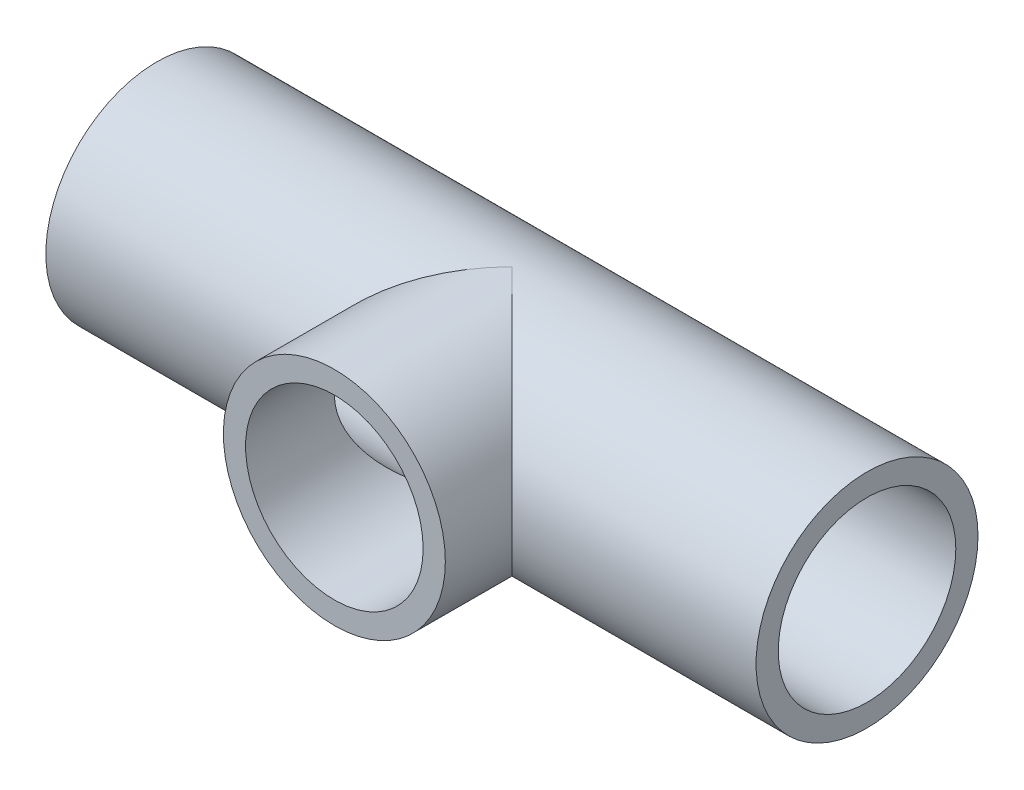
ISO-10303-21;
HEADER;
FILE_DESCRIPTION(('STEP AP214'),'2;1');
FILE_NAME('part.step','',(''),(''),'','','');
FILE_SCHEMA(('AUTOMOTIVE_DESIGN { 1 0 10303 214 1 1 1 1 }'));
ENDSEC;
DATA;
#1=APPLICATION_CONTEXT('core data for automotive mechanical design processes');
#2=APPLICATION_PROTOCOL_DEFINITION('international standard','automotive_design',2000,#1);
#3=PRODUCT_CONTEXT('',#1,'mechanical');
#4=PRODUCT('Part','Part','',(#3));
#5=PRODUCT_RELATED_PRODUCT_CATEGORY('part','',(#4));
#6=PRODUCT_DEFINITION_FORMATION('','',#4);
#7=PRODUCT_DEFINITION_CONTEXT('part definition',#1,'design');
#8=PRODUCT_DEFINITION('design','',#6,#7);
#9=PRODUCT_DEFINITION_SHAPE('','',#8);
#10=(LENGTH_UNIT() NAMED_UNIT(*) SI_UNIT(.MILLI.,.METRE.));
#11=(NAMED_UNIT(*) PLANE_ANGLE_UNIT() SI_UNIT($,.RADIAN.));
#12=(NAMED_UNIT(*) SI_UNIT($,.STERADIAN.) SOLID_ANGLE_UNIT());
#13=UNCERTAINTY_MEASURE_WITH_UNIT(LENGTH_MEASURE(1.E-05),#10,'distance_accuracy_value','');
#14=(GEOMETRIC_REPRESENTATION_CONTEXT(3) GLOBAL_UNCERTAINTY_ASSIGNED_CONTEXT((#13)) GLOBAL_UNIT_ASSIGNED_CONTEXT((#10,
#11,#12)) REPRESENTATION_CONTEXT('',''));
#15=CARTESIAN_POINT('',(0.,0.,0.));
#16=DIRECTION('',(0.,0.,1.));
#17=DIRECTION('',(1.,0.,0.));
#18=AXIS2_PLACEMENT_3D('',#15,#16,#17);
#19=CARTESIAN_POINT('',(0.,0.,12.7));
#20=DIRECTION('',(0.,0.,-1.));
#21=DIRECTION('',(-1.,0.,0.));
#22=AXIS2_PLACEMENT_3D('',#19,#20,#21);
#23=CYLINDRICAL_SURFACE('',#22,7.9375);
#24=CARTESIAN_POINT('',(0.,0.,12.7));
#25=DIRECTION('',(0.,0.,1.));
#26=DIRECTION('',(1.,0.,0.));
#27=AXIS2_PLACEMENT_3D('',#24,#25,#26);
#28=CIRCLE('',#27,7.9375);
#29=CARTESIAN_POINT('',(7.9375,0.,12.7));
#30=VERTEX_POINT('',#29);
#31=EDGE_CURVE('E11',#30,#30,#28,.T.);
#32=ORIENTED_EDGE('',*,*,#31,.F.);
#33=EDGE_LOOP('',(#32));
#34=FACE_BOUND('',#33,.T.);
#35=CARTESIAN_POINT('',(0.,0.,0.));
#36=DIRECTION('',(-0.707106781186547,0.,-0.707106781186547));
#37=DIRECTION('',(0.707106781186547,0.,-0.707106781186547));
#38=AXIS2_PLACEMENT_3D('',#35,#36,#37);
#39=ELLIPSE('',#38,11.2253201513364,7.9375);
#40=CARTESIAN_POINT('',(0.,-7.9375,0.));
#41=VERTEX_POINT('',#40);
#42=CARTESIAN_POINT('',(0.,7.9375,0.));
#43=VERTEX_POINT('',#42);
#44=EDGE_CURVE('E79',#41,#43,#39,.T.);
#45=ORIENTED_EDGE('',*,*,#44,.F.);
#46=CARTESIAN_POINT('',(0.,0.,0.));
#47=DIRECTION('',(0.707106781186547,0.,-0.707106781186547));
#48=DIRECTION('',(-0.707106781186547,0.,-0.707106781186547));
#49=AXIS2_PLACEMENT_3D('',#46,#47,#48);
#50=ELLIPSE('',#49,11.2253201513364,7.9375);
#51=EDGE_CURVE('E58',#43,#41,#50,.T.);
#52=ORIENTED_EDGE('',*,*,#51,.F.);
#53=EDGE_LOOP('',(#45,#52));
#54=FACE_BOUND('',#53,.T.);
#55=ADVANCED_FACE('F38',(#34,#54),#23,.T.);
#56=CARTESIAN_POINT('',(0.,0.,0.));
#57=DIRECTION('',(0.,0.,1.));
#58=DIRECTION('',(1.,0.,0.));
#59=AXIS2_PLACEMENT_3D('',#56,#57,#58);
#60=CYLINDRICAL_SURFACE('',#59,6.35);
#61=CARTESIAN_POINT('',(0.,0.,12.7));
#62=DIRECTION('',(0.,0.,1.));
#63=DIRECTION('',(1.,0.,0.));
#64=AXIS2_PLACEMENT_3D('',#61,#62,#63);
#65=CIRCLE('',#64,6.35);
#66=CARTESIAN_POINT('',(6.35,0.,12.7));
#67=VERTEX_POINT('',#66);
#68=EDGE_CURVE('E45',#67,#67,#65,.T.);
#69=ORIENTED_EDGE('',*,*,#68,.T.);
#70=EDGE_LOOP('',(#69));
#71=FACE_BOUND('',#70,.T.);
#72=CARTESIAN_POINT('',(0.,0.,0.));
#73=DIRECTION('',(-0.707106781186547,0.,0.707106781186547));
#74=DIRECTION('',(0.707106781186547,0.,0.707106781186547));
#75=AXIS2_PLACEMENT_3D('',#72,#73,#74);
#76=ELLIPSE('',#75,8.98025612106915,6.35);
#77=CARTESIAN_POINT('',(0.,6.35,0.));
#78=VERTEX_POINT('',#77);
#79=CARTESIAN_POINT('',(0.,-6.35,0.));
#80=VERTEX_POINT('',#79);
#81=EDGE_CURVE('E63',#78,#80,#76,.F.);
#82=ORIENTED_EDGE('',*,*,#81,.T.);
#83=CARTESIAN_POINT('',(0.,0.,0.));
#84=DIRECTION('',(0.707106781186547,0.,0.707106781186547));
#85=DIRECTION('',(-0.707106781186547,0.,0.707106781186547));
#86=AXIS2_PLACEMENT_3D('',#83,#84,#85);
#87=ELLIPSE('',#86,8.98025612106915,6.35);
#88=EDGE_CURVE('E51',#80,#78,#87,.F.);
#89=ORIENTED_EDGE('',*,*,#88,.T.);
#90=EDGE_LOOP('',(#82,#89));
#91=FACE_BOUND('',#90,.T.);
#92=ADVANCED_FACE('F68',(#71,#91),#60,.F.);
#93=CARTESIAN_POINT('',(0.,0.,12.7));
#94=DIRECTION('',(0.,0.,1.));
#95=DIRECTION('',(1.,0.,0.));
#96=AXIS2_PLACEMENT_3D('',#93,#94,#95);
#97=PLANE('',#96);
#98=ORIENTED_EDGE('',*,*,#68,.F.);
#99=EDGE_LOOP('',(#98));
#100=FACE_BOUND('',#99,.T.);
#101=ORIENTED_EDGE('',*,*,#31,.T.);
#102=EDGE_LOOP('',(#101));
#103=FACE_BOUND('',#102,.T.);
#104=ADVANCED_FACE('F84',(#100,#103),#97,.T.);
#105=CARTESIAN_POINT('',(25.4,0.,0.));
#106=DIRECTION('',(-1.,0.,0.));
#107=DIRECTION('',(0.,0.,1.));
#108=AXIS2_PLACEMENT_3D('',#105,#106,#107);
#109=CYLINDRICAL_SURFACE('',#108,7.9375);
#110=CARTESIAN_POINT('',(-25.4,0.,0.));
#111=DIRECTION('',(1.,0.,0.));
#112=DIRECTION('',(0.,0.,-1.));
#113=AXIS2_PLACEMENT_3D('',#110,#111,#112);
#114=CIRCLE('',#113,7.9375);
#115=CARTESIAN_POINT('',(-25.4,0.,-7.9375));
#116=VERTEX_POINT('',#115);
#117=EDGE_CURVE('E69',#116,#116,#114,.T.);
#118=ORIENTED_EDGE('',*,*,#117,.T.);
#119=EDGE_LOOP('',(#118));
#120=FACE_BOUND('',#119,.T.);
#121=CARTESIAN_POINT('',(25.4,0.,0.));
#122=DIRECTION('',(1.,0.,0.));
#123=DIRECTION('',(0.,0.,-1.));
#124=AXIS2_PLACEMENT_3D('',#121,#122,#123);
#125=CIRCLE('',#124,7.9375);
#126=CARTESIAN_POINT('',(25.4,0.,-7.9375));
#127=VERTEX_POINT('',#126);
#128=EDGE_CURVE('E72',#127,#127,#125,.T.);
#129=ORIENTED_EDGE('',*,*,#128,.F.);
#130=EDGE_LOOP('',(#129));
#131=FACE_BOUND('',#130,.T.);
#132=ORIENTED_EDGE('',*,*,#51,.T.);
#133=ORIENTED_EDGE('',*,*,#44,.T.);
#134=EDGE_LOOP('',(#132,#133));
#135=FACE_BOUND('',#134,.T.);
#136=ADVANCED_FACE('F87',(#120,#131,#135),#109,.T.);
#137=CARTESIAN_POINT('',(25.4,0.,0.));
#138=DIRECTION('',(1.,0.,0.));
#139=DIRECTION('',(0.,0.,-1.));
#140=AXIS2_PLACEMENT_3D('',#137,#138,#139);
#141=PLANE('',#140);
#142=CARTESIAN_POINT('',(25.4,0.,0.));
#143=DIRECTION('',(1.,0.,0.));
#144=DIRECTION('',(0.,0.,-1.));
#145=AXIS2_PLACEMENT_3D('',#142,#143,#144);
#146=CIRCLE('',#145,6.35);
#147=CARTESIAN_POINT('',(25.4,0.,-6.35));
#148=VERTEX_POINT('',#147);
#149=EDGE_CURVE('E159',#148,#148,#146,.T.);
#150=ORIENTED_EDGE('',*,*,#149,.F.);
#151=EDGE_LOOP('',(#150));
#152=FACE_BOUND('',#151,.T.);
#153=ORIENTED_EDGE('',*,*,#128,.T.);
#154=EDGE_LOOP('',(#153));
#155=FACE_BOUND('',#154,.T.);
#156=ADVANCED_FACE('F93',(#152,#155),#141,.T.);
#157=CARTESIAN_POINT('',(-25.4,0.,0.));
#158=DIRECTION('',(1.,0.,0.));
#159=DIRECTION('',(0.,0.,-1.));
#160=AXIS2_PLACEMENT_3D('',#157,#158,#159);
#161=PLANE('',#160);
#162=CARTESIAN_POINT('',(-25.4,0.,0.));
#163=DIRECTION('',(1.,0.,0.));
#164=DIRECTION('',(0.,0.,-1.));
#165=AXIS2_PLACEMENT_3D('',#162,#163,#164);
#166=CIRCLE('',#165,6.35);
#167=CARTESIAN_POINT('',(-25.4,0.,-6.35));
#168=VERTEX_POINT('',#167);
#169=EDGE_CURVE('E66',#168,#168,#166,.T.);
#170=ORIENTED_EDGE('',*,*,#169,.T.);
#171=EDGE_LOOP('',(#170));
#172=FACE_BOUND('',#171,.T.);
#173=ORIENTED_EDGE('',*,*,#117,.F.);
#174=EDGE_LOOP('',(#173));
#175=FACE_BOUND('',#174,.T.);
#176=ADVANCED_FACE('F99',(#172,#175),#161,.F.);
#177=CARTESIAN_POINT('',(-25.4,0.,0.));
#178=DIRECTION('',(1.,0.,0.));
#179=DIRECTION('',(0.,0.,-1.));
#180=AXIS2_PLACEMENT_3D('',#177,#178,#179);
#181=CYLINDRICAL_SURFACE('',#180,6.35);
#182=ORIENTED_EDGE('',*,*,#169,.F.);
#183=EDGE_LOOP('',(#182));
#184=FACE_BOUND('',#183,.T.);
#185=ORIENTED_EDGE('',*,*,#149,.T.);
#186=EDGE_LOOP('',(#185));
#187=FACE_BOUND('',#186,.T.);
#188=ORIENTED_EDGE('',*,*,#81,.F.);
#189=ORIENTED_EDGE('',*,*,#88,.F.);
#190=EDGE_LOOP('',(#188,#189));
#191=FACE_BOUND('',#190,.T.);
#192=ADVANCED_FACE('F64',(#184,#187,#191),#181,.F.);
#193=CLOSED_SHELL('',(#55,#92,#104,#136,#156,#176,#192));
#194=MANIFOLD_SOLID_BREP('B2',#193);
#195=ADVANCED_BREP_SHAPE_REPRESENTATION('',(#18,#194),#14);
#196=SHAPE_DEFINITION_REPRESENTATION(#9,#195);
ENDSEC;
END-ISO-10303-21;
